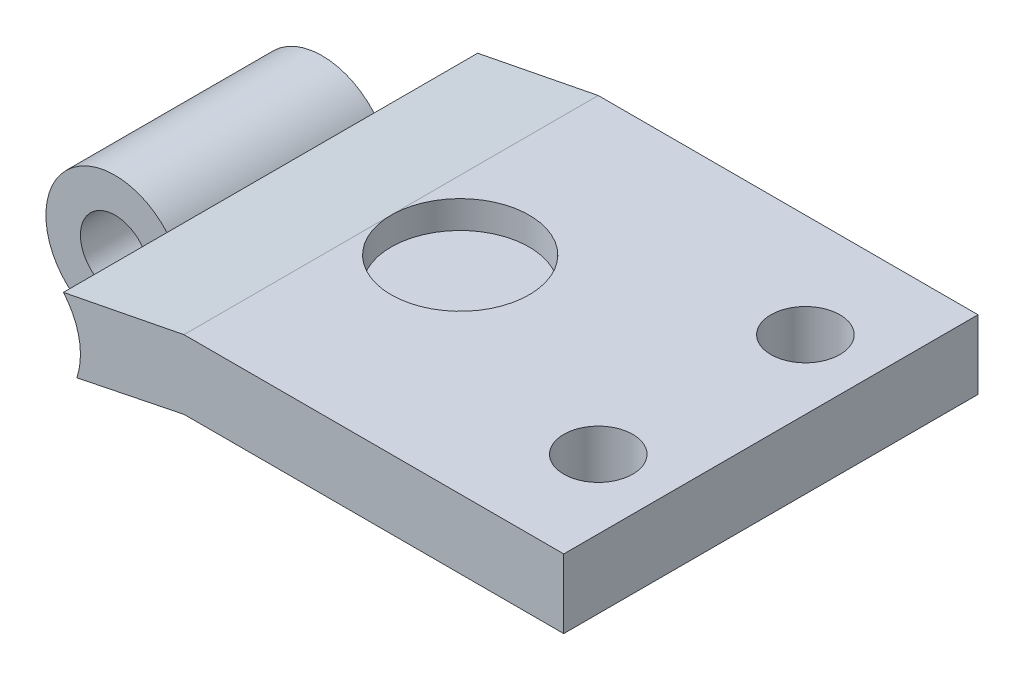
ISO-10303-21;
HEADER;
FILE_DESCRIPTION(('STEP AP214'),'2;1');
FILE_NAME('part.step','',(''),(''),'','','');
FILE_SCHEMA(('AUTOMOTIVE_DESIGN { 1 0 10303 214 1 1 1 1 }'));
ENDSEC;
DATA;
#1=APPLICATION_CONTEXT('core data for automotive mechanical design processes');
#2=APPLICATION_PROTOCOL_DEFINITION('international standard','automotive_design',2000,#1);
#3=PRODUCT_CONTEXT('',#1,'mechanical');
#4=PRODUCT('Part','Part','',(#3));
#5=PRODUCT_RELATED_PRODUCT_CATEGORY('part','',(#4));
#6=PRODUCT_DEFINITION_FORMATION('','',#4);
#7=PRODUCT_DEFINITION_CONTEXT('part definition',#1,'design');
#8=PRODUCT_DEFINITION('design','',#6,#7);
#9=PRODUCT_DEFINITION_SHAPE('','',#8);
#10=(LENGTH_UNIT() NAMED_UNIT(*) SI_UNIT(.MILLI.,.METRE.));
#11=(NAMED_UNIT(*) PLANE_ANGLE_UNIT() SI_UNIT($,.RADIAN.));
#12=(NAMED_UNIT(*) SI_UNIT($,.STERADIAN.) SOLID_ANGLE_UNIT());
#13=UNCERTAINTY_MEASURE_WITH_UNIT(LENGTH_MEASURE(1.E-05),#10,'distance_accuracy_value','');
#14=(GEOMETRIC_REPRESENTATION_CONTEXT(3) GLOBAL_UNCERTAINTY_ASSIGNED_CONTEXT((#13)) GLOBAL_UNIT_ASSIGNED_CONTEXT((#10,
#11,#12)) REPRESENTATION_CONTEXT('',''));
#15=CARTESIAN_POINT('',(0.,0.,0.));
#16=DIRECTION('',(0.,0.,1.));
#17=DIRECTION('',(1.,0.,0.));
#18=AXIS2_PLACEMENT_3D('',#15,#16,#17);
#19=CARTESIAN_POINT('',(-28.8183992967822,0.0562335264896636,30.));
#20=DIRECTION('',(0.,0.,-1.));
#21=DIRECTION('',(-1.,0.,0.));
#22=AXIS2_PLACEMENT_3D('',#19,#20,#21);
#23=CYLINDRICAL_SURFACE('',#22,5.00000000000172);
#24=CARTESIAN_POINT('',(-28.8183992967822,0.0562335264896636,7.5));
#25=DIRECTION('',(0.,0.,-1.));
#26=DIRECTION('',(-1.,0.,0.));
#27=AXIS2_PLACEMENT_3D('',#24,#25,#26);
#28=CIRCLE('',#27,5.00000000000064);
#29=CARTESIAN_POINT('',(-24.0757414295573,-1.52717935537529,7.5));
#30=VERTEX_POINT('',#29);
#31=CARTESIAN_POINT('',(-25.0505671139845,3.34309230688785,7.5));
#32=VERTEX_POINT('',#31);
#33=EDGE_CURVE('E136',#30,#32,#28,.T.);
#34=ORIENTED_EDGE('',*,*,#33,.F.);
#35=DIRECTION('',(0.,0.,-1.));
#36=VECTOR('',#35,1.);
#37=CARTESIAN_POINT('',(-24.0757414295561,-1.52717935537512,30.));
#38=LINE('',#37,#36);
#39=CARTESIAN_POINT('',(-24.0757414295561,-1.52717935537512,22.5));
#40=VERTEX_POINT('',#39);
#41=EDGE_CURVE('E164',#40,#30,#38,.T.);
#42=ORIENTED_EDGE('',*,*,#41,.F.);
#43=CARTESIAN_POINT('',(-28.8183992967822,0.0562335264896636,22.5));
#44=DIRECTION('',(0.,0.,1.));
#45=DIRECTION('',(1.,0.,0.));
#46=AXIS2_PLACEMENT_3D('',#43,#44,#45);
#47=CIRCLE('',#46,4.99999999999976);
#48=CARTESIAN_POINT('',(-25.0505671139848,3.34309230688674,22.5));
#49=VERTEX_POINT('',#48);
#50=EDGE_CURVE('E55',#49,#40,#47,.T.);
#51=ORIENTED_EDGE('',*,*,#50,.F.);
#52=DIRECTION('',(0.,0.,-1.));
#53=VECTOR('',#52,1.);
#54=CARTESIAN_POINT('',(-25.0505671139832,3.34309230688812,30.));
#55=LINE('',#54,#53);
#56=EDGE_CURVE('E163',#49,#32,#55,.T.);
#57=ORIENTED_EDGE('',*,*,#56,.T.);
#58=EDGE_LOOP('',(#34,#42,#51,#57));
#59=FACE_BOUND('',#58,.T.);
#60=ADVANCED_FACE('F40',(#59),#23,.T.);
#61=CARTESIAN_POINT('',(-28.8183992967822,0.0562335264896636,30.));
#62=DIRECTION('',(0.,0.,-1.));
#63=DIRECTION('',(-1.,0.,0.));
#64=AXIS2_PLACEMENT_3D('',#61,#62,#63);
#65=CYLINDRICAL_SURFACE('',#64,2.49999999999925);
#66=CARTESIAN_POINT('',(-28.8183992967822,0.0562335264896636,22.5));
#67=DIRECTION('',(0.,0.,1.));
#68=DIRECTION('',(1.,0.,0.));
#69=AXIS2_PLACEMENT_3D('',#66,#67,#68);
#70=CIRCLE('',#69,2.49999999999925);
#71=CARTESIAN_POINT('',(-26.318399296783,0.0562335264896636,22.5));
#72=VERTEX_POINT('',#71);
#73=EDGE_CURVE('E44',#72,#72,#70,.T.);
#74=ORIENTED_EDGE('',*,*,#73,.T.);
#75=EDGE_LOOP('',(#74));
#76=FACE_BOUND('',#75,.T.);
#77=CARTESIAN_POINT('',(-28.8183992967822,0.0562335264896636,7.5));
#78=DIRECTION('',(0.,0.,-1.));
#79=DIRECTION('',(-1.,0.,0.));
#80=AXIS2_PLACEMENT_3D('',#77,#78,#79);
#81=CIRCLE('',#80,2.49999999999925);
#82=CARTESIAN_POINT('',(-31.3183992967815,0.0562335264896636,7.5));
#83=VERTEX_POINT('',#82);
#84=EDGE_CURVE('E129',#83,#83,#81,.T.);
#85=ORIENTED_EDGE('',*,*,#84,.T.);
#86=EDGE_LOOP('',(#85));
#87=FACE_BOUND('',#86,.T.);
#88=ADVANCED_FACE('F205',(#76,#87),#65,.F.);
#89=CARTESIAN_POINT('',(-28.8183992967822,0.0562335264896636,30.));
#90=DIRECTION('',(0.,0.,1.));
#91=DIRECTION('',(1.,0.,0.));
#92=AXIS2_PLACEMENT_3D('',#89,#90,#91);
#93=PLANE('',#92);
#94=CARTESIAN_POINT('',(-28.8183992967822,0.0562335264896636,30.));
#95=DIRECTION('',(0.,0.,1.));
#96=DIRECTION('',(1.,0.,0.));
#97=AXIS2_PLACEMENT_3D('',#94,#95,#96);
#98=CIRCLE('',#97,4.99999999999976);
#99=CARTESIAN_POINT('',(-24.0757414295583,-1.5271793553755,30.));
#100=VERTEX_POINT('',#99);
#101=CARTESIAN_POINT('',(-25.0505671139848,3.34309230688674,30.));
#102=VERTEX_POINT('',#101);
#103=EDGE_CURVE('E128',#100,#102,#98,.T.);
#104=ORIENTED_EDGE('',*,*,#103,.F.);
#105=DIRECTION('',(0.979797083902118,0.199994185857753,0.));
#106=VECTOR('',#105,1.);
#107=CARTESIAN_POINT('',(-24.0757414295562,-1.52717935537507,30.));
#108=LINE('',#107,#106);
#109=CARTESIAN_POINT('',(-16.3183992967825,0.0562335264896642,30.));
#110=VERTEX_POINT('',#109);
#111=EDGE_CURVE('E177',#100,#110,#108,.T.);
#112=ORIENTED_EDGE('',*,*,#111,.T.);
#113=DIRECTION('',(1.,0.,0.));
#114=VECTOR('',#113,1.);
#115=CARTESIAN_POINT('',(-16.3183992967825,0.0562335264896642,30.));
#116=LINE('',#115,#114);
#117=CARTESIAN_POINT('',(11.1828195679477,0.0562335264896638,30.));
#118=VERTEX_POINT('',#117);
#119=EDGE_CURVE('E178',#110,#118,#116,.T.);
#120=ORIENTED_EDGE('',*,*,#119,.T.);
#121=DIRECTION('',(0.,1.,0.));
#122=VECTOR('',#121,1.);
#123=CARTESIAN_POINT('',(11.1828195679477,0.0562335264896638,30.));
#124=LINE('',#123,#122);
#125=CARTESIAN_POINT('',(11.1828195679477,5.05623352648943,30.));
#126=VERTEX_POINT('',#125);
#127=EDGE_CURVE('E144',#118,#126,#124,.T.);
#128=ORIENTED_EDGE('',*,*,#127,.T.);
#129=DIRECTION('',(-1.,0.,0.));
#130=VECTOR('',#129,1.);
#131=CARTESIAN_POINT('',(3.92281956794827,5.05623352648943,30.));
#132=LINE('',#131,#130);
#133=CARTESIAN_POINT('',(-16.3183992967795,5.05623352648942,30.));
#134=VERTEX_POINT('',#133);
#135=EDGE_CURVE('E64',#126,#134,#132,.T.);
#136=ORIENTED_EDGE('',*,*,#135,.T.);
#137=DIRECTION('',(-0.981293555539514,-0.192517422215805,0.));
#138=VECTOR('',#137,1.);
#139=CARTESIAN_POINT('',(-25.0505671139832,3.34309230688812,30.));
#140=LINE('',#139,#138);
#141=EDGE_CURVE('E96',#134,#102,#140,.T.);
#142=ORIENTED_EDGE('',*,*,#141,.T.);
#143=EDGE_LOOP('',(#104,#112,#120,#128,#136,#142));
#144=FACE_BOUND('',#143,.T.);
#145=ADVANCED_FACE('F185',(#144),#93,.T.);
#146=CARTESIAN_POINT('',(-28.8183992967822,0.0562335264896636,0.));
#147=DIRECTION('',(0.,0.,1.));
#148=DIRECTION('',(1.,0.,0.));
#149=AXIS2_PLACEMENT_3D('',#146,#147,#148);
#150=PLANE('',#149);
#151=DIRECTION('',(0.979797083902118,0.199994185857753,0.));
#152=VECTOR('',#151,1.);
#153=CARTESIAN_POINT('',(-24.0757414295562,-1.52717935537507,0.));
#154=LINE('',#153,#152);
#155=CARTESIAN_POINT('',(-24.0757414295561,-1.52717935537512,0.));
#156=VERTEX_POINT('',#155);
#157=CARTESIAN_POINT('',(-16.3183992967825,0.0562335264896642,0.));
#158=VERTEX_POINT('',#157);
#159=EDGE_CURVE('E135',#156,#158,#154,.T.);
#160=ORIENTED_EDGE('',*,*,#159,.F.);
#161=CARTESIAN_POINT('',(-28.8183992967822,0.0562335264896636,0.));
#162=DIRECTION('',(0.,0.,-1.));
#163=DIRECTION('',(-1.,0.,0.));
#164=AXIS2_PLACEMENT_3D('',#161,#162,#163);
#165=CIRCLE('',#164,5.00000000000064);
#166=CARTESIAN_POINT('',(-25.0505671139845,3.34309230688785,0.));
#167=VERTEX_POINT('',#166);
#168=EDGE_CURVE('E121',#167,#156,#165,.T.);
#169=ORIENTED_EDGE('',*,*,#168,.F.);
#170=DIRECTION('',(-0.981293555539514,-0.192517422215805,0.));
#171=VECTOR('',#170,1.);
#172=CARTESIAN_POINT('',(-25.0505671139832,3.34309230688812,0.));
#173=LINE('',#172,#171);
#174=CARTESIAN_POINT('',(-16.3183992967795,5.05623352648942,0.));
#175=VERTEX_POINT('',#174);
#176=EDGE_CURVE('E133',#175,#167,#173,.T.);
#177=ORIENTED_EDGE('',*,*,#176,.F.);
#178=DIRECTION('',(-1.,0.,0.));
#179=VECTOR('',#178,1.);
#180=CARTESIAN_POINT('',(6.18281956794766,5.05623352648943,0.));
#181=LINE('',#180,#179);
#182=CARTESIAN_POINT('',(11.1828195679477,5.05623352648943,0.));
#183=VERTEX_POINT('',#182);
#184=EDGE_CURVE('E89',#183,#175,#181,.T.);
#185=ORIENTED_EDGE('',*,*,#184,.F.);
#186=DIRECTION('',(0.,1.,0.));
#187=VECTOR('',#186,1.);
#188=CARTESIAN_POINT('',(11.1828195679477,0.0562335264896638,0.));
#189=LINE('',#188,#187);
#190=CARTESIAN_POINT('',(11.1828195679477,0.0562335264896638,0.));
#191=VERTEX_POINT('',#190);
#192=EDGE_CURVE('E148',#191,#183,#189,.T.);
#193=ORIENTED_EDGE('',*,*,#192,.F.);
#194=DIRECTION('',(1.,0.,0.));
#195=VECTOR('',#194,1.);
#196=CARTESIAN_POINT('',(6.18281956794766,0.0562335264896638,0.));
#197=LINE('',#196,#195);
#198=EDGE_CURVE('E140',#158,#191,#197,.T.);
#199=ORIENTED_EDGE('',*,*,#198,.F.);
#200=EDGE_LOOP('',(#160,#169,#177,#185,#193,#199));
#201=FACE_BOUND('',#200,.T.);
#202=ADVANCED_FACE('F132',(#201),#150,.F.);
#203=CARTESIAN_POINT('',(-25.0505671139832,3.34309230688812,30.));
#204=DIRECTION('',(0.192517422215805,-0.981293555539514,0.));
#205=DIRECTION('',(0.981293555539514,0.192517422215805,0.));
#206=AXIS2_PLACEMENT_3D('',#203,#204,#205);
#207=PLANE('',#206);
#208=ORIENTED_EDGE('',*,*,#176,.T.);
#209=DIRECTION('',(0.,0.,-1.));
#210=VECTOR('',#209,1.);
#211=CARTESIAN_POINT('',(-25.0505671139845,3.34309230688785,7.5));
#212=LINE('',#211,#210);
#213=EDGE_CURVE('E118',#167,#32,#212,.F.);
#214=ORIENTED_EDGE('',*,*,#213,.T.);
#215=ORIENTED_EDGE('',*,*,#56,.F.);
#216=EDGE_CURVE('E49',#102,#49,#55,.T.);
#217=ORIENTED_EDGE('',*,*,#216,.F.);
#218=ORIENTED_EDGE('',*,*,#141,.F.);
#219=DIRECTION('',(0.,0.,-1.));
#220=VECTOR('',#219,1.);
#221=CARTESIAN_POINT('',(-16.3183992967795,5.05623352648942,30.));
#222=LINE('',#221,#220);
#223=EDGE_CURVE('E11',#134,#175,#222,.T.);
#224=ORIENTED_EDGE('',*,*,#223,.T.);
#225=EDGE_LOOP('',(#208,#214,#215,#217,#218,#224));
#226=FACE_BOUND('',#225,.T.);
#227=ADVANCED_FACE('F42',(#226),#207,.F.);
#228=CARTESIAN_POINT('',(-24.0757414295562,-1.52717935537507,30.));
#229=DIRECTION('',(-0.199994185857753,0.979797083902118,0.));
#230=DIRECTION('',(-0.979797083902118,-0.199994185857753,0.));
#231=AXIS2_PLACEMENT_3D('',#228,#229,#230);
#232=PLANE('',#231);
#233=ORIENTED_EDGE('',*,*,#159,.T.);
#234=DIRECTION('',(0.,0.,-1.));
#235=VECTOR('',#234,1.);
#236=CARTESIAN_POINT('',(-16.3183992967825,0.0562335264896642,30.));
#237=LINE('',#236,#235);
#238=EDGE_CURVE('E156',#110,#158,#237,.T.);
#239=ORIENTED_EDGE('',*,*,#238,.F.);
#240=ORIENTED_EDGE('',*,*,#111,.F.);
#241=EDGE_CURVE('E160',#100,#40,#38,.T.);
#242=ORIENTED_EDGE('',*,*,#241,.T.);
#243=ORIENTED_EDGE('',*,*,#41,.T.);
#244=EDGE_CURVE('E159',#30,#156,#38,.T.);
#245=ORIENTED_EDGE('',*,*,#244,.T.);
#246=EDGE_LOOP('',(#233,#239,#240,#242,#243,#245));
#247=FACE_BOUND('',#246,.T.);
#248=ADVANCED_FACE('F212',(#247),#232,.F.);
#249=CARTESIAN_POINT('',(6.18281956794766,0.0562335264896638,30.));
#250=DIRECTION('',(0.,1.,0.));
#251=DIRECTION('',(-1.,0.,0.));
#252=AXIS2_PLACEMENT_3D('',#249,#250,#251);
#253=PLANE('',#252);
#254=CARTESIAN_POINT('',(6.18281956794766,0.0562335264894277,22.5));
#255=DIRECTION('',(0.,1.,0.));
#256=DIRECTION('',(0.,0.,1.));
#257=AXIS2_PLACEMENT_3D('',#254,#255,#256);
#258=CIRCLE('',#257,2.5);
#259=CARTESIAN_POINT('',(6.18281956794766,0.0562335264894277,25.));
#260=VERTEX_POINT('',#259);
#261=EDGE_CURVE('E223',#260,#260,#258,.T.);
#262=ORIENTED_EDGE('',*,*,#261,.T.);
#263=EDGE_LOOP('',(#262));
#264=FACE_BOUND('',#263,.T.);
#265=CARTESIAN_POINT('',(6.18281956794766,0.0562335264894277,7.5));
#266=DIRECTION('',(0.,1.,0.));
#267=DIRECTION('',(0.,0.,1.));
#268=AXIS2_PLACEMENT_3D('',#265,#266,#267);
#269=CIRCLE('',#268,2.5);
#270=CARTESIAN_POINT('',(6.18281956794766,0.0562335264894277,10.));
#271=VERTEX_POINT('',#270);
#272=EDGE_CURVE('E227',#271,#271,#269,.T.);
#273=ORIENTED_EDGE('',*,*,#272,.T.);
#274=EDGE_LOOP('',(#273));
#275=FACE_BOUND('',#274,.T.);
#276=ORIENTED_EDGE('',*,*,#198,.T.);
#277=DIRECTION('',(0.,0.,-1.));
#278=VECTOR('',#277,1.);
#279=CARTESIAN_POINT('',(11.1828195679477,0.0562335264896638,30.));
#280=LINE('',#279,#278);
#281=EDGE_CURVE('E153',#118,#191,#280,.T.);
#282=ORIENTED_EDGE('',*,*,#281,.F.);
#283=ORIENTED_EDGE('',*,*,#119,.F.);
#284=ORIENTED_EDGE('',*,*,#238,.T.);
#285=EDGE_LOOP('',(#276,#282,#283,#284));
#286=FACE_BOUND('',#285,.T.);
#287=ADVANCED_FACE('F199',(#264,#275,#286),#253,.F.);
#288=CARTESIAN_POINT('',(11.1828195679477,0.0562335264896638,30.));
#289=DIRECTION('',(-1.,0.,0.));
#290=DIRECTION('',(0.,0.,1.));
#291=AXIS2_PLACEMENT_3D('',#288,#289,#290);
#292=PLANE('',#291);
#293=ORIENTED_EDGE('',*,*,#192,.T.);
#294=DIRECTION('',(0.,0.,-1.));
#295=VECTOR('',#294,1.);
#296=CARTESIAN_POINT('',(11.1828195679477,5.05623352648943,30.));
#297=LINE('',#296,#295);
#298=EDGE_CURVE('E151',#126,#183,#297,.T.);
#299=ORIENTED_EDGE('',*,*,#298,.F.);
#300=ORIENTED_EDGE('',*,*,#127,.F.);
#301=ORIENTED_EDGE('',*,*,#281,.T.);
#302=EDGE_LOOP('',(#293,#299,#300,#301));
#303=FACE_BOUND('',#302,.T.);
#304=ADVANCED_FACE('F187',(#303),#292,.F.);
#305=CARTESIAN_POINT('',(6.18281956794766,5.05623352648943,30.));
#306=DIRECTION('',(0.,-1.,0.));
#307=DIRECTION('',(0.,0.,-1.));
#308=AXIS2_PLACEMENT_3D('',#305,#306,#307);
#309=PLANE('',#308);
#310=CARTESIAN_POINT('',(6.18281956794766,5.05623352648943,22.5));
#311=DIRECTION('',(0.,1.,0.));
#312=DIRECTION('',(0.,0.,1.));
#313=AXIS2_PLACEMENT_3D('',#310,#311,#312);
#314=CIRCLE('',#313,2.5);
#315=CARTESIAN_POINT('',(6.18281956794766,5.05623352648943,25.));
#316=VERTEX_POINT('',#315);
#317=EDGE_CURVE('E244',#316,#316,#314,.T.);
#318=ORIENTED_EDGE('',*,*,#317,.F.);
#319=EDGE_LOOP('',(#318));
#320=FACE_BOUND('',#319,.T.);
#321=CARTESIAN_POINT('',(6.18281956794766,5.05623352648943,7.5));
#322=DIRECTION('',(0.,1.,0.));
#323=DIRECTION('',(0.,0.,1.));
#324=AXIS2_PLACEMENT_3D('',#321,#322,#323);
#325=CIRCLE('',#324,2.5);
#326=CARTESIAN_POINT('',(6.18281956794766,5.05623352648943,10.));
#327=VERTEX_POINT('',#326);
#328=EDGE_CURVE('E240',#327,#327,#325,.T.);
#329=ORIENTED_EDGE('',*,*,#328,.F.);
#330=EDGE_LOOP('',(#329));
#331=FACE_BOUND('',#330,.T.);
#332=CARTESIAN_POINT('',(-11.3171804320523,5.05623352648943,15.));
#333=DIRECTION('',(0.,1.,0.));
#334=DIRECTION('',(0.,0.,1.));
#335=AXIS2_PLACEMENT_3D('',#332,#333,#334);
#336=CIRCLE('',#335,5.);
#337=CARTESIAN_POINT('',(-11.3171804320523,5.05623352648943,20.));
#338=VERTEX_POINT('',#337);
#339=EDGE_CURVE('E235',#338,#338,#336,.T.);
#340=ORIENTED_EDGE('',*,*,#339,.F.);
#341=EDGE_LOOP('',(#340));
#342=FACE_BOUND('',#341,.T.);
#343=ORIENTED_EDGE('',*,*,#184,.T.);
#344=ORIENTED_EDGE('',*,*,#223,.F.);
#345=ORIENTED_EDGE('',*,*,#135,.F.);
#346=ORIENTED_EDGE('',*,*,#298,.T.);
#347=EDGE_LOOP('',(#343,#344,#345,#346));
#348=FACE_BOUND('',#347,.T.);
#349=ADVANCED_FACE('F188',(#320,#331,#342,#348),#309,.F.);
#350=CARTESIAN_POINT('',(-28.8183992967822,0.0562335264896636,22.5));
#351=DIRECTION('',(0.,0.,1.));
#352=DIRECTION('',(1.,0.,0.));
#353=AXIS2_PLACEMENT_3D('',#350,#351,#352);
#354=CYLINDRICAL_SURFACE('',#353,4.99999999999976);
#355=EDGE_CURVE('E170',#40,#49,#47,.T.);
#356=ORIENTED_EDGE('',*,*,#355,.F.);
#357=ORIENTED_EDGE('',*,*,#241,.F.);
#358=ORIENTED_EDGE('',*,*,#103,.T.);
#359=ORIENTED_EDGE('',*,*,#216,.T.);
#360=EDGE_LOOP('',(#356,#357,#358,#359));
#361=FACE_BOUND('',#360,.T.);
#362=ADVANCED_FACE('F190',(#361),#354,.F.);
#363=CARTESIAN_POINT('',(-28.8183992967822,0.0562335264896636,22.5));
#364=DIRECTION('',(0.,0.,1.));
#365=DIRECTION('',(1.,0.,0.));
#366=AXIS2_PLACEMENT_3D('',#363,#364,#365);
#367=PLANE('',#366);
#368=ORIENTED_EDGE('',*,*,#73,.F.);
#369=EDGE_LOOP('',(#368));
#370=FACE_BOUND('',#369,.T.);
#371=ORIENTED_EDGE('',*,*,#50,.T.);
#372=ORIENTED_EDGE('',*,*,#355,.T.);
#373=EDGE_LOOP('',(#371,#372));
#374=FACE_BOUND('',#373,.T.);
#375=ADVANCED_FACE('F197',(#370,#374),#367,.T.);
#376=CARTESIAN_POINT('',(-28.8183992967822,0.0562335264896636,7.5));
#377=DIRECTION('',(0.,0.,-1.));
#378=DIRECTION('',(-1.,0.,0.));
#379=AXIS2_PLACEMENT_3D('',#376,#377,#378);
#380=CYLINDRICAL_SURFACE('',#379,5.00000000000064);
#381=ORIENTED_EDGE('',*,*,#168,.T.);
#382=ORIENTED_EDGE('',*,*,#244,.F.);
#383=EDGE_CURVE('E124',#32,#30,#28,.T.);
#384=ORIENTED_EDGE('',*,*,#383,.F.);
#385=ORIENTED_EDGE('',*,*,#213,.F.);
#386=EDGE_LOOP('',(#381,#382,#384,#385));
#387=FACE_BOUND('',#386,.T.);
#388=ADVANCED_FACE('F120',(#387),#380,.F.);
#389=CARTESIAN_POINT('',(-28.8183992967822,0.0562335264896636,7.5));
#390=DIRECTION('',(0.,0.,-1.));
#391=DIRECTION('',(-1.,0.,0.));
#392=AXIS2_PLACEMENT_3D('',#389,#390,#391);
#393=PLANE('',#392);
#394=ORIENTED_EDGE('',*,*,#84,.F.);
#395=EDGE_LOOP('',(#394));
#396=FACE_BOUND('',#395,.T.);
#397=ORIENTED_EDGE('',*,*,#383,.T.);
#398=ORIENTED_EDGE('',*,*,#33,.T.);
#399=EDGE_LOOP('',(#397,#398));
#400=FACE_BOUND('',#399,.T.);
#401=ADVANCED_FACE('F231',(#396,#400),#393,.T.);
#402=CARTESIAN_POINT('',(-11.3171804320523,3.05623352648943,15.));
#403=DIRECTION('',(0.,1.,0.));
#404=DIRECTION('',(0.,0.,1.));
#405=AXIS2_PLACEMENT_3D('',#402,#403,#404);
#406=CYLINDRICAL_SURFACE('',#405,5.);
#407=CARTESIAN_POINT('',(-11.3171804320523,3.05623352648943,15.));
#408=DIRECTION('',(0.,1.,0.));
#409=DIRECTION('',(0.,0.,1.));
#410=AXIS2_PLACEMENT_3D('',#407,#408,#409);
#411=CIRCLE('',#410,5.);
#412=CARTESIAN_POINT('',(-11.3171804320523,3.05623352648943,20.));
#413=VERTEX_POINT('',#412);
#414=EDGE_CURVE('E137',#413,#413,#411,.T.);
#415=ORIENTED_EDGE('',*,*,#414,.F.);
#416=EDGE_LOOP('',(#415));
#417=FACE_BOUND('',#416,.T.);
#418=ORIENTED_EDGE('',*,*,#339,.T.);
#419=EDGE_LOOP('',(#418));
#420=FACE_BOUND('',#419,.T.);
#421=ADVANCED_FACE('F262',(#417,#420),#406,.F.);
#422=CARTESIAN_POINT('',(-11.3171804320523,3.05623352648943,15.));
#423=DIRECTION('',(0.,1.,0.));
#424=DIRECTION('',(0.,0.,1.));
#425=AXIS2_PLACEMENT_3D('',#422,#423,#424);
#426=PLANE('',#425);
#427=ORIENTED_EDGE('',*,*,#414,.T.);
#428=EDGE_LOOP('',(#427));
#429=FACE_BOUND('',#428,.T.);
#430=ADVANCED_FACE('F256',(#429),#426,.T.);
#431=CARTESIAN_POINT('',(6.18281956794766,0.0562335264894277,7.5));
#432=DIRECTION('',(0.,1.,0.));
#433=DIRECTION('',(0.,0.,1.));
#434=AXIS2_PLACEMENT_3D('',#431,#432,#433);
#435=CYLINDRICAL_SURFACE('',#434,2.5);
#436=ORIENTED_EDGE('',*,*,#272,.F.);
#437=EDGE_LOOP('',(#436));
#438=FACE_BOUND('',#437,.T.);
#439=ORIENTED_EDGE('',*,*,#328,.T.);
#440=EDGE_LOOP('',(#439));
#441=FACE_BOUND('',#440,.T.);
#442=ADVANCED_FACE('F250',(#438,#441),#435,.F.);
#443=CARTESIAN_POINT('',(6.18281956794766,0.0562335264894277,22.5));
#444=DIRECTION('',(0.,1.,0.));
#445=DIRECTION('',(0.,0.,1.));
#446=AXIS2_PLACEMENT_3D('',#443,#444,#445);
#447=CYLINDRICAL_SURFACE('',#446,2.5);
#448=ORIENTED_EDGE('',*,*,#261,.F.);
#449=EDGE_LOOP('',(#448));
#450=FACE_BOUND('',#449,.T.);
#451=ORIENTED_EDGE('',*,*,#317,.T.);
#452=EDGE_LOOP('',(#451));
#453=FACE_BOUND('',#452,.T.);
#454=ADVANCED_FACE('F248',(#450,#453),#447,.F.);
#455=CLOSED_SHELL('',(#60,#88,#145,#202,#227,#248,#287,#304,#349,#362,#375,#388,#401,#421,#430,
#442,#454));
#456=MANIFOLD_SOLID_BREP('B2',#455);
#457=ADVANCED_BREP_SHAPE_REPRESENTATION('',(#18,#456),#14);
#458=SHAPE_DEFINITION_REPRESENTATION(#9,#457);
ENDSEC;
END-ISO-10303-21;
